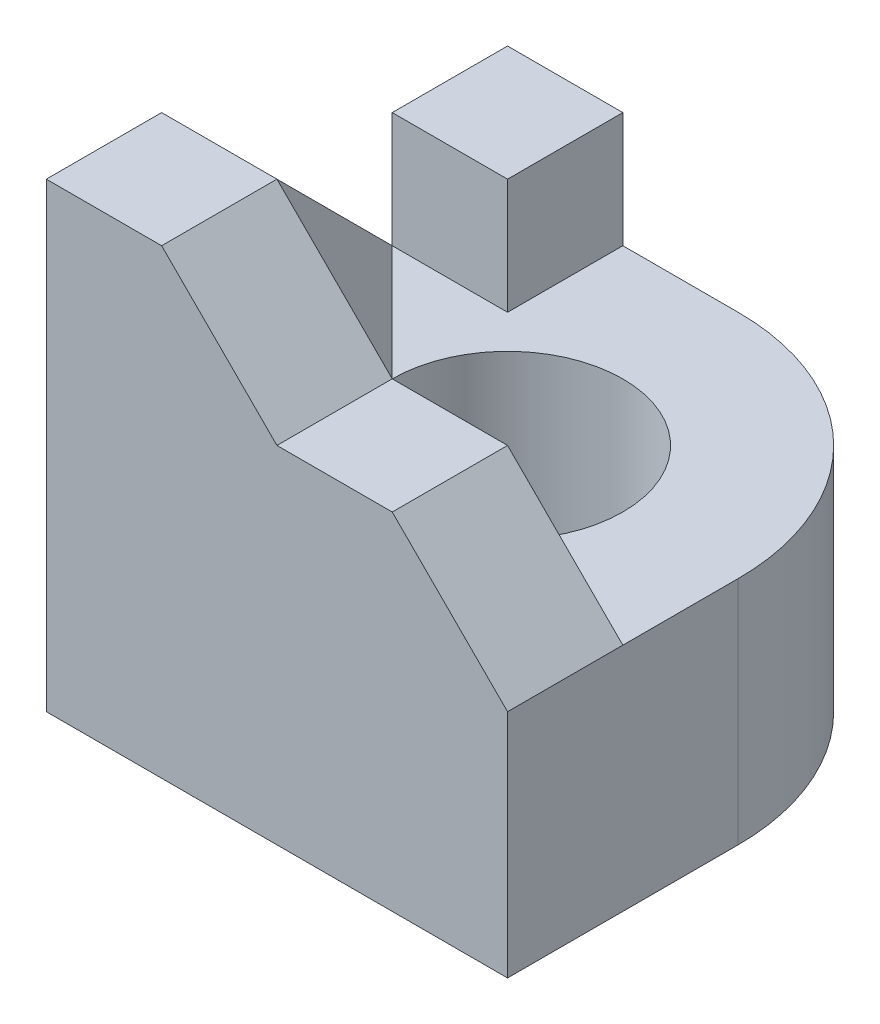
ISO-10303-21;
HEADER;
FILE_DESCRIPTION(('STEP AP214'),'2;1');
FILE_NAME('part.step','',(''),(''),'','','');
FILE_SCHEMA(('AUTOMOTIVE_DESIGN { 1 0 10303 214 1 1 1 1 }'));
ENDSEC;
DATA;
#1=APPLICATION_CONTEXT('core data for automotive mechanical design processes');
#2=APPLICATION_PROTOCOL_DEFINITION('international standard','automotive_design',2000,#1);
#3=PRODUCT_CONTEXT('',#1,'mechanical');
#4=PRODUCT('Part','Part','',(#3));
#5=PRODUCT_RELATED_PRODUCT_CATEGORY('part','',(#4));
#6=PRODUCT_DEFINITION_FORMATION('','',#4);
#7=PRODUCT_DEFINITION_CONTEXT('part definition',#1,'design');
#8=PRODUCT_DEFINITION('design','',#6,#7);
#9=PRODUCT_DEFINITION_SHAPE('','',#8);
#10=(LENGTH_UNIT() NAMED_UNIT(*) SI_UNIT(.MILLI.,.METRE.));
#11=(NAMED_UNIT(*) PLANE_ANGLE_UNIT() SI_UNIT($,.RADIAN.));
#12=(NAMED_UNIT(*) SI_UNIT($,.STERADIAN.) SOLID_ANGLE_UNIT());
#13=UNCERTAINTY_MEASURE_WITH_UNIT(LENGTH_MEASURE(1.E-05),#10,'distance_accuracy_value','');
#14=(GEOMETRIC_REPRESENTATION_CONTEXT(3) GLOBAL_UNCERTAINTY_ASSIGNED_CONTEXT((#13)) GLOBAL_UNIT_ASSIGNED_CONTEXT((#10,
#11,#12)) REPRESENTATION_CONTEXT('',''));
#15=CARTESIAN_POINT('',(0.,0.,0.));
#16=DIRECTION('',(0.,0.,1.));
#17=DIRECTION('',(1.,0.,0.));
#18=AXIS2_PLACEMENT_3D('',#15,#16,#17);
#19=CARTESIAN_POINT('',(0.,20.,0.));
#20=DIRECTION('',(0.,1.,0.));
#21=DIRECTION('',(0.,0.,1.));
#22=AXIS2_PLACEMENT_3D('',#19,#20,#21);
#23=PLANE('',#22);
#24=DIRECTION('',(1.,0.,0.));
#25=VECTOR('',#24,1.);
#26=CARTESIAN_POINT('',(20.,20.,10.));
#27=LINE('',#26,#25);
#28=CARTESIAN_POINT('',(0.,20.,10.));
#29=VERTEX_POINT('',#28);
#30=CARTESIAN_POINT('',(20.,20.,10.));
#31=VERTEX_POINT('',#30);
#32=EDGE_CURVE('E162',#29,#31,#27,.T.);
#33=ORIENTED_EDGE('',*,*,#32,.T.);
#34=DIRECTION('',(0.,0.,-1.));
#35=VECTOR('',#34,1.);
#36=CARTESIAN_POINT('',(20.,20.,20.));
#37=LINE('',#36,#35);
#38=CARTESIAN_POINT('',(20.,20.,0.));
#39=VERTEX_POINT('',#38);
#40=EDGE_CURVE('E242',#31,#39,#37,.T.);
#41=ORIENTED_EDGE('',*,*,#40,.T.);
#42=CARTESIAN_POINT('',(0.,20.,0.));
#43=DIRECTION('',(0.,1.,0.));
#44=DIRECTION('',(0.,0.,1.));
#45=AXIS2_PLACEMENT_3D('',#42,#43,#44);
#46=CIRCLE('',#45,20.);
#47=CARTESIAN_POINT('',(0.,20.,-20.));
#48=VERTEX_POINT('',#47);
#49=EDGE_CURVE('E241',#39,#48,#46,.T.);
#50=ORIENTED_EDGE('',*,*,#49,.T.);
#51=DIRECTION('',(-1.,0.,0.));
#52=VECTOR('',#51,1.);
#53=CARTESIAN_POINT('',(-20.,20.,-20.));
#54=LINE('',#53,#52);
#55=CARTESIAN_POINT('',(-10.,20.,-20.));
#56=VERTEX_POINT('',#55);
#57=EDGE_CURVE('E245',#48,#56,#54,.T.);
#58=ORIENTED_EDGE('',*,*,#57,.T.);
#59=DIRECTION('',(0.,0.,1.));
#60=VECTOR('',#59,1.);
#61=CARTESIAN_POINT('',(-10.,20.,-10.));
#62=LINE('',#61,#60);
#63=CARTESIAN_POINT('',(-10.,20.,-10.));
#64=VERTEX_POINT('',#63);
#65=EDGE_CURVE('E196',#56,#64,#62,.T.);
#66=ORIENTED_EDGE('',*,*,#65,.T.);
#67=DIRECTION('',(-1.,0.,0.));
#68=VECTOR('',#67,1.);
#69=CARTESIAN_POINT('',(-10.,20.,-10.));
#70=LINE('',#69,#68);
#71=CARTESIAN_POINT('',(-20.,20.,-10.));
#72=VERTEX_POINT('',#71);
#73=EDGE_CURVE('E213',#64,#72,#70,.T.);
#74=ORIENTED_EDGE('',*,*,#73,.T.);
#75=DIRECTION('',(0.,0.,1.));
#76=VECTOR('',#75,1.);
#77=CARTESIAN_POINT('',(-20.,20.,20.));
#78=LINE('',#77,#76);
#79=CARTESIAN_POINT('',(-20.,20.,0.));
#80=VERTEX_POINT('',#79);
#81=EDGE_CURVE('E61',#72,#80,#78,.T.);
#82=ORIENTED_EDGE('',*,*,#81,.T.);
#83=DIRECTION('',(-1.,0.,0.));
#84=VECTOR('',#83,1.);
#85=CARTESIAN_POINT('',(-10.,20.,0.));
#86=LINE('',#85,#84);
#87=CARTESIAN_POINT('',(-10.,20.,0.));
#88=VERTEX_POINT('',#87);
#89=EDGE_CURVE('E328',#88,#80,#86,.T.);
#90=ORIENTED_EDGE('',*,*,#89,.F.);
#91=CARTESIAN_POINT('',(0.,20.,0.));
#92=DIRECTION('',(0.,1.,0.));
#93=DIRECTION('',(0.,0.,1.));
#94=AXIS2_PLACEMENT_3D('',#91,#92,#93);
#95=CIRCLE('',#94,10.);
#96=EDGE_CURVE('E68',#29,#88,#95,.T.);
#97=ORIENTED_EDGE('',*,*,#96,.F.);
#98=EDGE_LOOP('',(#33,#41,#50,#58,#66,#74,#82,#90,#97));
#99=FACE_BOUND('',#98,.T.);
#100=ADVANCED_FACE('F45',(#99),#23,.T.);
#101=CARTESIAN_POINT('',(-10.,20.,10.));
#102=VERTEX_POINT('',#101);
#103=EDGE_CURVE('E154',#102,#29,#27,.T.);
#104=ORIENTED_EDGE('',*,*,#103,.T.);
#105=EDGE_CURVE('E183',#88,#29,#95,.T.);
#106=ORIENTED_EDGE('',*,*,#105,.F.);
#107=DIRECTION('',(0.,0.,1.));
#108=VECTOR('',#107,1.);
#109=CARTESIAN_POINT('',(-10.,20.,0.));
#110=LINE('',#109,#108);
#111=EDGE_CURVE('E174',#88,#102,#110,.T.);
#112=ORIENTED_EDGE('',*,*,#111,.T.);
#113=EDGE_LOOP('',(#104,#106,#112));
#114=FACE_BOUND('',#113,.T.);
#115=ADVANCED_FACE('F182',(#114),#23,.T.);
#116=CARTESIAN_POINT('',(0.,0.,0.));
#117=DIRECTION('',(0.,1.,0.));
#118=DIRECTION('',(0.,0.,1.));
#119=AXIS2_PLACEMENT_3D('',#116,#117,#118);
#120=PLANE('',#119);
#121=DIRECTION('',(1.,0.,0.));
#122=VECTOR('',#121,1.);
#123=CARTESIAN_POINT('',(-20.,0.,20.));
#124=LINE('',#123,#122);
#125=CARTESIAN_POINT('',(-20.,0.,20.));
#126=VERTEX_POINT('',#125);
#127=CARTESIAN_POINT('',(20.,0.,20.));
#128=VERTEX_POINT('',#127);
#129=EDGE_CURVE('E234',#126,#128,#124,.T.);
#130=ORIENTED_EDGE('',*,*,#129,.F.);
#131=DIRECTION('',(0.,0.,1.));
#132=VECTOR('',#131,1.);
#133=CARTESIAN_POINT('',(-20.,0.,20.));
#134=LINE('',#133,#132);
#135=CARTESIAN_POINT('',(-20.,0.,-20.));
#136=VERTEX_POINT('',#135);
#137=EDGE_CURVE('E264',#136,#126,#134,.T.);
#138=ORIENTED_EDGE('',*,*,#137,.F.);
#139=DIRECTION('',(-1.,0.,0.));
#140=VECTOR('',#139,1.);
#141=CARTESIAN_POINT('',(-20.,0.,-20.));
#142=LINE('',#141,#140);
#143=CARTESIAN_POINT('',(0.,0.,-20.));
#144=VERTEX_POINT('',#143);
#145=EDGE_CURVE('E261',#144,#136,#142,.T.);
#146=ORIENTED_EDGE('',*,*,#145,.F.);
#147=CARTESIAN_POINT('',(0.,0.,0.));
#148=DIRECTION('',(0.,1.,0.));
#149=DIRECTION('',(0.,0.,1.));
#150=AXIS2_PLACEMENT_3D('',#147,#148,#149);
#151=CIRCLE('',#150,20.);
#152=CARTESIAN_POINT('',(20.,0.,0.));
#153=VERTEX_POINT('',#152);
#154=EDGE_CURVE('E258',#153,#144,#151,.T.);
#155=ORIENTED_EDGE('',*,*,#154,.F.);
#156=DIRECTION('',(0.,0.,-1.));
#157=VECTOR('',#156,1.);
#158=CARTESIAN_POINT('',(20.,0.,20.));
#159=LINE('',#158,#157);
#160=EDGE_CURVE('E255',#128,#153,#159,.T.);
#161=ORIENTED_EDGE('',*,*,#160,.F.);
#162=EDGE_LOOP('',(#130,#138,#146,#155,#161));
#163=FACE_BOUND('',#162,.T.);
#164=CARTESIAN_POINT('',(0.,0.,0.));
#165=DIRECTION('',(0.,1.,0.));
#166=DIRECTION('',(0.,0.,1.));
#167=AXIS2_PLACEMENT_3D('',#164,#165,#166);
#168=CIRCLE('',#167,10.);
#169=CARTESIAN_POINT('',(0.,0.,10.));
#170=VERTEX_POINT('',#169);
#171=EDGE_CURVE('E226',#170,#170,#168,.T.);
#172=ORIENTED_EDGE('',*,*,#171,.T.);
#173=EDGE_LOOP('',(#172));
#174=FACE_BOUND('',#173,.T.);
#175=ADVANCED_FACE('F290',(#163,#174),#120,.F.);
#176=CARTESIAN_POINT('',(-20.,20.,20.));
#177=DIRECTION('',(0.,0.,-1.));
#178=DIRECTION('',(-1.,0.,0.));
#179=AXIS2_PLACEMENT_3D('',#176,#177,#178);
#180=PLANE('',#179);
#181=DIRECTION('',(0.,-1.,0.));
#182=VECTOR('',#181,1.);
#183=CARTESIAN_POINT('',(20.,20.,20.));
#184=LINE('',#183,#182);
#185=CARTESIAN_POINT('',(20.,20.,20.));
#186=VERTEX_POINT('',#185);
#187=EDGE_CURVE('E11',#186,#128,#184,.T.);
#188=ORIENTED_EDGE('',*,*,#187,.F.);
#189=DIRECTION('',(-0.707106781186548,0.707106781186547,0.));
#190=VECTOR('',#189,1.);
#191=CARTESIAN_POINT('',(10.,30.,20.));
#192=LINE('',#191,#190);
#193=CARTESIAN_POINT('',(10.,30.,20.));
#194=VERTEX_POINT('',#193);
#195=EDGE_CURVE('E351',#186,#194,#192,.T.);
#196=ORIENTED_EDGE('',*,*,#195,.T.);
#197=DIRECTION('',(-1.,0.,0.));
#198=VECTOR('',#197,1.);
#199=CARTESIAN_POINT('',(0.,30.,20.));
#200=LINE('',#199,#198);
#201=CARTESIAN_POINT('',(0.,30.,20.));
#202=VERTEX_POINT('',#201);
#203=EDGE_CURVE('E347',#194,#202,#200,.T.);
#204=ORIENTED_EDGE('',*,*,#203,.T.);
#205=DIRECTION('',(-0.707106781186548,0.707106781186548,0.));
#206=VECTOR('',#205,1.);
#207=CARTESIAN_POINT('',(-10.,40.,20.));
#208=LINE('',#207,#206);
#209=CARTESIAN_POINT('',(-10.,40.,20.));
#210=VERTEX_POINT('',#209);
#211=EDGE_CURVE('E180',#202,#210,#208,.T.);
#212=ORIENTED_EDGE('',*,*,#211,.T.);
#213=DIRECTION('',(-1.,0.,0.));
#214=VECTOR('',#213,1.);
#215=CARTESIAN_POINT('',(-10.,40.,20.));
#216=LINE('',#215,#214);
#217=CARTESIAN_POINT('',(-20.,40.,20.));
#218=VERTEX_POINT('',#217);
#219=EDGE_CURVE('E319',#210,#218,#216,.T.);
#220=ORIENTED_EDGE('',*,*,#219,.T.);
#221=DIRECTION('',(0.,-1.,0.));
#222=VECTOR('',#221,1.);
#223=CARTESIAN_POINT('',(-20.,20.,20.));
#224=LINE('',#223,#222);
#225=EDGE_CURVE('E251',#218,#126,#224,.T.);
#226=ORIENTED_EDGE('',*,*,#225,.T.);
#227=ORIENTED_EDGE('',*,*,#129,.T.);
#228=EDGE_LOOP('',(#188,#196,#204,#212,#220,#226,#227));
#229=FACE_BOUND('',#228,.T.);
#230=ADVANCED_FACE('F47',(#229),#180,.F.);
#231=CARTESIAN_POINT('',(20.,20.,20.));
#232=DIRECTION('',(-1.,0.,0.));
#233=DIRECTION('',(0.,0.,1.));
#234=AXIS2_PLACEMENT_3D('',#231,#232,#233);
#235=PLANE('',#234);
#236=ORIENTED_EDGE('',*,*,#160,.T.);
#237=DIRECTION('',(0.,-1.,0.));
#238=VECTOR('',#237,1.);
#239=CARTESIAN_POINT('',(20.,20.,0.));
#240=LINE('',#239,#238);
#241=EDGE_CURVE('E54',#39,#153,#240,.T.);
#242=ORIENTED_EDGE('',*,*,#241,.F.);
#243=ORIENTED_EDGE('',*,*,#40,.F.);
#244=EDGE_CURVE('E238',#186,#31,#37,.T.);
#245=ORIENTED_EDGE('',*,*,#244,.F.);
#246=ORIENTED_EDGE('',*,*,#187,.T.);
#247=EDGE_LOOP('',(#236,#242,#243,#245,#246));
#248=FACE_BOUND('',#247,.T.);
#249=ADVANCED_FACE('F372',(#248),#235,.F.);
#250=CARTESIAN_POINT('',(0.,20.,0.));
#251=DIRECTION('',(0.,-1.,0.));
#252=DIRECTION('',(0.,0.,-1.));
#253=AXIS2_PLACEMENT_3D('',#250,#251,#252);
#254=CYLINDRICAL_SURFACE('',#253,20.);
#255=ORIENTED_EDGE('',*,*,#154,.T.);
#256=DIRECTION('',(0.,-1.,0.));
#257=VECTOR('',#256,1.);
#258=CARTESIAN_POINT('',(0.,20.,-20.));
#259=LINE('',#258,#257);
#260=EDGE_CURVE('E274',#48,#144,#259,.T.);
#261=ORIENTED_EDGE('',*,*,#260,.F.);
#262=ORIENTED_EDGE('',*,*,#49,.F.);
#263=ORIENTED_EDGE('',*,*,#241,.T.);
#264=EDGE_LOOP('',(#255,#261,#262,#263));
#265=FACE_BOUND('',#264,.T.);
#266=ADVANCED_FACE('F283',(#265),#254,.T.);
#267=CARTESIAN_POINT('',(-20.,20.,-20.));
#268=DIRECTION('',(0.,0.,1.));
#269=DIRECTION('',(1.,0.,0.));
#270=AXIS2_PLACEMENT_3D('',#267,#268,#269);
#271=PLANE('',#270);
#272=ORIENTED_EDGE('',*,*,#145,.T.);
#273=DIRECTION('',(0.,-1.,0.));
#274=VECTOR('',#273,1.);
#275=CARTESIAN_POINT('',(-20.,20.,-20.));
#276=LINE('',#275,#274);
#277=CARTESIAN_POINT('',(-20.,30.,-20.));
#278=VERTEX_POINT('',#277);
#279=EDGE_CURVE('E270',#278,#136,#276,.T.);
#280=ORIENTED_EDGE('',*,*,#279,.F.);
#281=DIRECTION('',(-1.,0.,0.));
#282=VECTOR('',#281,1.);
#283=CARTESIAN_POINT('',(-10.,30.,-20.));
#284=LINE('',#283,#282);
#285=CARTESIAN_POINT('',(-10.,30.,-20.));
#286=VERTEX_POINT('',#285);
#287=EDGE_CURVE('E222',#286,#278,#284,.T.);
#288=ORIENTED_EDGE('',*,*,#287,.F.);
#289=DIRECTION('',(0.,-1.,0.));
#290=VECTOR('',#289,1.);
#291=CARTESIAN_POINT('',(-10.,20.,-20.));
#292=LINE('',#291,#290);
#293=EDGE_CURVE('E209',#286,#56,#292,.T.);
#294=ORIENTED_EDGE('',*,*,#293,.T.);
#295=ORIENTED_EDGE('',*,*,#57,.F.);
#296=ORIENTED_EDGE('',*,*,#260,.T.);
#297=EDGE_LOOP('',(#272,#280,#288,#294,#295,#296));
#298=FACE_BOUND('',#297,.T.);
#299=ADVANCED_FACE('F294',(#298),#271,.F.);
#300=CARTESIAN_POINT('',(-20.,20.,20.));
#301=DIRECTION('',(1.,0.,0.));
#302=DIRECTION('',(0.,0.,-1.));
#303=AXIS2_PLACEMENT_3D('',#300,#301,#302);
#304=PLANE('',#303);
#305=ORIENTED_EDGE('',*,*,#137,.T.);
#306=ORIENTED_EDGE('',*,*,#225,.F.);
#307=DIRECTION('',(0.,0.,-1.));
#308=VECTOR('',#307,1.);
#309=CARTESIAN_POINT('',(-20.,40.,20.));
#310=LINE('',#309,#308);
#311=CARTESIAN_POINT('',(-20.,40.,10.));
#312=VERTEX_POINT('',#311);
#313=EDGE_CURVE('E218',#218,#312,#310,.T.);
#314=ORIENTED_EDGE('',*,*,#313,.T.);
#315=DIRECTION('',(0.,-0.707106781186548,-0.707106781186547));
#316=VECTOR('',#315,1.);
#317=CARTESIAN_POINT('',(-20.,40.,10.));
#318=LINE('',#317,#316);
#319=CARTESIAN_POINT('',(-20.,30.,0.));
#320=VERTEX_POINT('',#319);
#321=EDGE_CURVE('E191',#312,#320,#318,.T.);
#322=ORIENTED_EDGE('',*,*,#321,.T.);
#323=DIRECTION('',(0.,-1.,0.));
#324=VECTOR('',#323,1.);
#325=CARTESIAN_POINT('',(-20.,30.,0.));
#326=LINE('',#325,#324);
#327=EDGE_CURVE('E185',#320,#80,#326,.T.);
#328=ORIENTED_EDGE('',*,*,#327,.T.);
#329=ORIENTED_EDGE('',*,*,#81,.F.);
#330=DIRECTION('',(0.,1.,0.));
#331=VECTOR('',#330,1.);
#332=CARTESIAN_POINT('',(-20.,30.,-10.));
#333=LINE('',#332,#331);
#334=CARTESIAN_POINT('',(-20.,30.,-10.));
#335=VERTEX_POINT('',#334);
#336=EDGE_CURVE('E214',#72,#335,#333,.T.);
#337=ORIENTED_EDGE('',*,*,#336,.T.);
#338=DIRECTION('',(0.,0.,-1.));
#339=VECTOR('',#338,1.);
#340=CARTESIAN_POINT('',(-20.,30.,-20.));
#341=LINE('',#340,#339);
#342=EDGE_CURVE('E201',#335,#278,#341,.T.);
#343=ORIENTED_EDGE('',*,*,#342,.T.);
#344=ORIENTED_EDGE('',*,*,#279,.T.);
#345=EDGE_LOOP('',(#305,#306,#314,#322,#328,#329,#337,#343,#344));
#346=FACE_BOUND('',#345,.T.);
#347=ADVANCED_FACE('F297',(#346),#304,.F.);
#348=CARTESIAN_POINT('',(0.,20.,0.));
#349=DIRECTION('',(0.,-1.,0.));
#350=DIRECTION('',(0.,0.,-1.));
#351=AXIS2_PLACEMENT_3D('',#348,#349,#350);
#352=CYLINDRICAL_SURFACE('',#351,10.);
#353=ORIENTED_EDGE('',*,*,#105,.T.);
#354=ORIENTED_EDGE('',*,*,#96,.T.);
#355=EDGE_LOOP('',(#353,#354));
#356=FACE_BOUND('',#355,.T.);
#357=ORIENTED_EDGE('',*,*,#171,.F.);
#358=EDGE_LOOP('',(#357));
#359=FACE_BOUND('',#358,.T.);
#360=ADVANCED_FACE('F397',(#356,#359),#352,.F.);
#361=CARTESIAN_POINT('',(-10.,30.,-20.));
#362=DIRECTION('',(0.,1.,0.));
#363=DIRECTION('',(0.,0.,1.));
#364=AXIS2_PLACEMENT_3D('',#361,#362,#363);
#365=PLANE('',#364);
#366=ORIENTED_EDGE('',*,*,#342,.F.);
#367=DIRECTION('',(-1.,0.,0.));
#368=VECTOR('',#367,1.);
#369=CARTESIAN_POINT('',(-10.,30.,-10.));
#370=LINE('',#369,#368);
#371=CARTESIAN_POINT('',(-10.,30.,-10.));
#372=VERTEX_POINT('',#371);
#373=EDGE_CURVE('E227',#372,#335,#370,.T.);
#374=ORIENTED_EDGE('',*,*,#373,.F.);
#375=DIRECTION('',(0.,0.,-1.));
#376=VECTOR('',#375,1.);
#377=CARTESIAN_POINT('',(-10.,30.,-20.));
#378=LINE('',#377,#376);
#379=EDGE_CURVE('E205',#372,#286,#378,.T.);
#380=ORIENTED_EDGE('',*,*,#379,.T.);
#381=ORIENTED_EDGE('',*,*,#287,.T.);
#382=EDGE_LOOP('',(#366,#374,#380,#381));
#383=FACE_BOUND('',#382,.T.);
#384=ADVANCED_FACE('F300',(#383),#365,.T.);
#385=CARTESIAN_POINT('',(-10.,30.,-10.));
#386=DIRECTION('',(0.,0.,1.));
#387=DIRECTION('',(0.,-1.,0.));
#388=AXIS2_PLACEMENT_3D('',#385,#386,#387);
#389=PLANE('',#388);
#390=ORIENTED_EDGE('',*,*,#336,.F.);
#391=ORIENTED_EDGE('',*,*,#73,.F.);
#392=DIRECTION('',(0.,1.,0.));
#393=VECTOR('',#392,1.);
#394=CARTESIAN_POINT('',(-10.,30.,-10.));
#395=LINE('',#394,#393);
#396=EDGE_CURVE('E200',#64,#372,#395,.T.);
#397=ORIENTED_EDGE('',*,*,#396,.T.);
#398=ORIENTED_EDGE('',*,*,#373,.T.);
#399=EDGE_LOOP('',(#390,#391,#397,#398));
#400=FACE_BOUND('',#399,.T.);
#401=ADVANCED_FACE('F431',(#400),#389,.T.);
#402=CARTESIAN_POINT('',(-10.,0.,0.));
#403=DIRECTION('',(1.,0.,0.));
#404=DIRECTION('',(0.,0.,-1.));
#405=AXIS2_PLACEMENT_3D('',#402,#403,#404);
#406=PLANE('',#405);
#407=ORIENTED_EDGE('',*,*,#65,.F.);
#408=ORIENTED_EDGE('',*,*,#293,.F.);
#409=ORIENTED_EDGE('',*,*,#379,.F.);
#410=ORIENTED_EDGE('',*,*,#396,.F.);
#411=EDGE_LOOP('',(#407,#408,#409,#410));
#412=FACE_BOUND('',#411,.T.);
#413=ADVANCED_FACE('F440',(#412),#406,.T.);
#414=CARTESIAN_POINT('',(-10.,30.,0.));
#415=DIRECTION('',(0.,0.,-1.));
#416=DIRECTION('',(0.,1.,0.));
#417=AXIS2_PLACEMENT_3D('',#414,#415,#416);
#418=PLANE('',#417);
#419=ORIENTED_EDGE('',*,*,#327,.F.);
#420=DIRECTION('',(-1.,0.,0.));
#421=VECTOR('',#420,1.);
#422=CARTESIAN_POINT('',(-10.,30.,0.));
#423=LINE('',#422,#421);
#424=CARTESIAN_POINT('',(-10.,30.,0.));
#425=VERTEX_POINT('',#424);
#426=EDGE_CURVE('E324',#425,#320,#423,.T.);
#427=ORIENTED_EDGE('',*,*,#426,.F.);
#428=DIRECTION('',(0.,-1.,0.));
#429=VECTOR('',#428,1.);
#430=CARTESIAN_POINT('',(-10.,30.,0.));
#431=LINE('',#430,#429);
#432=EDGE_CURVE('E317',#425,#88,#431,.T.);
#433=ORIENTED_EDGE('',*,*,#432,.T.);
#434=ORIENTED_EDGE('',*,*,#89,.T.);
#435=EDGE_LOOP('',(#419,#427,#433,#434));
#436=FACE_BOUND('',#435,.T.);
#437=ADVANCED_FACE('F327',(#436),#418,.T.);
#438=CARTESIAN_POINT('',(-10.,40.,10.));
#439=DIRECTION('',(0.,0.707106781186547,-0.707106781186548));
#440=DIRECTION('',(0.,0.707106781186548,0.707106781186547));
#441=AXIS2_PLACEMENT_3D('',#438,#439,#440);
#442=PLANE('',#441);
#443=ORIENTED_EDGE('',*,*,#321,.F.);
#444=DIRECTION('',(-1.,0.,0.));
#445=VECTOR('',#444,1.);
#446=CARTESIAN_POINT('',(-10.,40.,10.));
#447=LINE('',#446,#445);
#448=CARTESIAN_POINT('',(-10.,40.,10.));
#449=VERTEX_POINT('',#448);
#450=EDGE_CURVE('E325',#449,#312,#447,.T.);
#451=ORIENTED_EDGE('',*,*,#450,.F.);
#452=DIRECTION('',(0.,-0.707106781186548,-0.707106781186547));
#453=VECTOR('',#452,1.);
#454=CARTESIAN_POINT('',(-10.,40.,10.));
#455=LINE('',#454,#453);
#456=EDGE_CURVE('E177',#449,#425,#455,.T.);
#457=ORIENTED_EDGE('',*,*,#456,.T.);
#458=ORIENTED_EDGE('',*,*,#426,.T.);
#459=EDGE_LOOP('',(#443,#451,#457,#458));
#460=FACE_BOUND('',#459,.T.);
#461=ADVANCED_FACE('F323',(#460),#442,.T.);
#462=CARTESIAN_POINT('',(-10.,40.,20.));
#463=DIRECTION('',(0.,1.,0.));
#464=DIRECTION('',(0.,0.,1.));
#465=AXIS2_PLACEMENT_3D('',#462,#463,#464);
#466=PLANE('',#465);
#467=ORIENTED_EDGE('',*,*,#313,.F.);
#468=ORIENTED_EDGE('',*,*,#219,.F.);
#469=DIRECTION('',(0.,0.,-1.));
#470=VECTOR('',#469,1.);
#471=CARTESIAN_POINT('',(-10.,40.,20.));
#472=LINE('',#471,#470);
#473=EDGE_CURVE('E186',#210,#449,#472,.T.);
#474=ORIENTED_EDGE('',*,*,#473,.T.);
#475=ORIENTED_EDGE('',*,*,#450,.T.);
#476=EDGE_LOOP('',(#467,#468,#474,#475));
#477=FACE_BOUND('',#476,.T.);
#478=ADVANCED_FACE('F376',(#477),#466,.T.);
#479=CARTESIAN_POINT('',(-10.,0.,0.));
#480=DIRECTION('',(-1.,0.,0.));
#481=DIRECTION('',(0.,0.,1.));
#482=AXIS2_PLACEMENT_3D('',#479,#480,#481);
#483=PLANE('',#482);
#484=ORIENTED_EDGE('',*,*,#456,.F.);
#485=DIRECTION('',(0.,-1.,0.));
#486=VECTOR('',#485,1.);
#487=CARTESIAN_POINT('',(-10.,20.,10.));
#488=LINE('',#487,#486);
#489=EDGE_CURVE('E158',#449,#102,#488,.T.);
#490=ORIENTED_EDGE('',*,*,#489,.T.);
#491=ORIENTED_EDGE('',*,*,#111,.F.);
#492=ORIENTED_EDGE('',*,*,#432,.F.);
#493=EDGE_LOOP('',(#484,#490,#491,#492));
#494=FACE_BOUND('',#493,.T.);
#495=ADVANCED_FACE('F172',(#494),#483,.F.);
#496=CARTESIAN_POINT('',(-10.,40.,10.));
#497=DIRECTION('',(0.707106781186548,0.707106781186548,0.));
#498=DIRECTION('',(-0.707106781186548,0.707106781186548,0.));
#499=AXIS2_PLACEMENT_3D('',#496,#497,#498);
#500=PLANE('',#499);
#501=ORIENTED_EDGE('',*,*,#211,.F.);
#502=DIRECTION('',(0.,0.,1.));
#503=VECTOR('',#502,1.);
#504=CARTESIAN_POINT('',(0.,30.,10.));
#505=LINE('',#504,#503);
#506=CARTESIAN_POINT('',(0.,30.,10.));
#507=VERTEX_POINT('',#506);
#508=EDGE_CURVE('E334',#507,#202,#505,.T.);
#509=ORIENTED_EDGE('',*,*,#508,.F.);
#510=DIRECTION('',(-0.707106781186548,0.707106781186548,0.));
#511=VECTOR('',#510,1.);
#512=CARTESIAN_POINT('',(-10.,40.,10.));
#513=LINE('',#512,#511);
#514=EDGE_CURVE('E342',#507,#449,#513,.T.);
#515=ORIENTED_EDGE('',*,*,#514,.T.);
#516=ORIENTED_EDGE('',*,*,#473,.F.);
#517=EDGE_LOOP('',(#501,#509,#515,#516));
#518=FACE_BOUND('',#517,.T.);
#519=ADVANCED_FACE('F379',(#518),#500,.T.);
#520=CARTESIAN_POINT('',(0.,30.,10.));
#521=DIRECTION('',(0.,1.,0.));
#522=DIRECTION('',(0.,0.,1.));
#523=AXIS2_PLACEMENT_3D('',#520,#521,#522);
#524=PLANE('',#523);
#525=ORIENTED_EDGE('',*,*,#203,.F.);
#526=DIRECTION('',(0.,0.,1.));
#527=VECTOR('',#526,1.);
#528=CARTESIAN_POINT('',(10.,30.,10.));
#529=LINE('',#528,#527);
#530=CARTESIAN_POINT('',(10.,30.,10.));
#531=VERTEX_POINT('',#530);
#532=EDGE_CURVE('E339',#531,#194,#529,.T.);
#533=ORIENTED_EDGE('',*,*,#532,.F.);
#534=DIRECTION('',(-1.,0.,0.));
#535=VECTOR('',#534,1.);
#536=CARTESIAN_POINT('',(0.,30.,10.));
#537=LINE('',#536,#535);
#538=EDGE_CURVE('E357',#531,#507,#537,.T.);
#539=ORIENTED_EDGE('',*,*,#538,.T.);
#540=ORIENTED_EDGE('',*,*,#508,.T.);
#541=EDGE_LOOP('',(#525,#533,#539,#540));
#542=FACE_BOUND('',#541,.T.);
#543=ADVANCED_FACE('F368',(#542),#524,.T.);
#544=CARTESIAN_POINT('',(10.,30.,10.));
#545=DIRECTION('',(0.707106781186547,0.707106781186548,0.));
#546=DIRECTION('',(-0.707106781186548,0.707106781186547,0.));
#547=AXIS2_PLACEMENT_3D('',#544,#545,#546);
#548=PLANE('',#547);
#549=ORIENTED_EDGE('',*,*,#195,.F.);
#550=ORIENTED_EDGE('',*,*,#244,.T.);
#551=DIRECTION('',(-0.707106781186548,0.707106781186547,0.));
#552=VECTOR('',#551,1.);
#553=CARTESIAN_POINT('',(10.,30.,10.));
#554=LINE('',#553,#552);
#555=EDGE_CURVE('E167',#31,#531,#554,.T.);
#556=ORIENTED_EDGE('',*,*,#555,.T.);
#557=ORIENTED_EDGE('',*,*,#532,.T.);
#558=EDGE_LOOP('',(#549,#550,#556,#557));
#559=FACE_BOUND('',#558,.T.);
#560=ADVANCED_FACE('F364',(#559),#548,.T.);
#561=CARTESIAN_POINT('',(0.,0.,10.));
#562=DIRECTION('',(0.,0.,-1.));
#563=DIRECTION('',(-1.,0.,0.));
#564=AXIS2_PLACEMENT_3D('',#561,#562,#563);
#565=PLANE('',#564);
#566=ORIENTED_EDGE('',*,*,#489,.F.);
#567=ORIENTED_EDGE('',*,*,#514,.F.);
#568=ORIENTED_EDGE('',*,*,#538,.F.);
#569=ORIENTED_EDGE('',*,*,#555,.F.);
#570=ORIENTED_EDGE('',*,*,#32,.F.);
#571=ORIENTED_EDGE('',*,*,#103,.F.);
#572=EDGE_LOOP('',(#566,#567,#568,#569,#570,#571));
#573=FACE_BOUND('',#572,.T.);
#574=ADVANCED_FACE('F156',(#573),#565,.T.);
#575=CLOSED_SHELL('',(#100,#115,#175,#230,#249,#266,#299,#347,#360,#384,#401,#413,#437,#461,
#478,#495,#519,#543,#560,#574));
#576=MANIFOLD_SOLID_BREP('B2',#575);
#577=ADVANCED_BREP_SHAPE_REPRESENTATION('',(#18,#576),#14);
#578=SHAPE_DEFINITION_REPRESENTATION(#9,#577);
ENDSEC;
END-ISO-10303-21;
